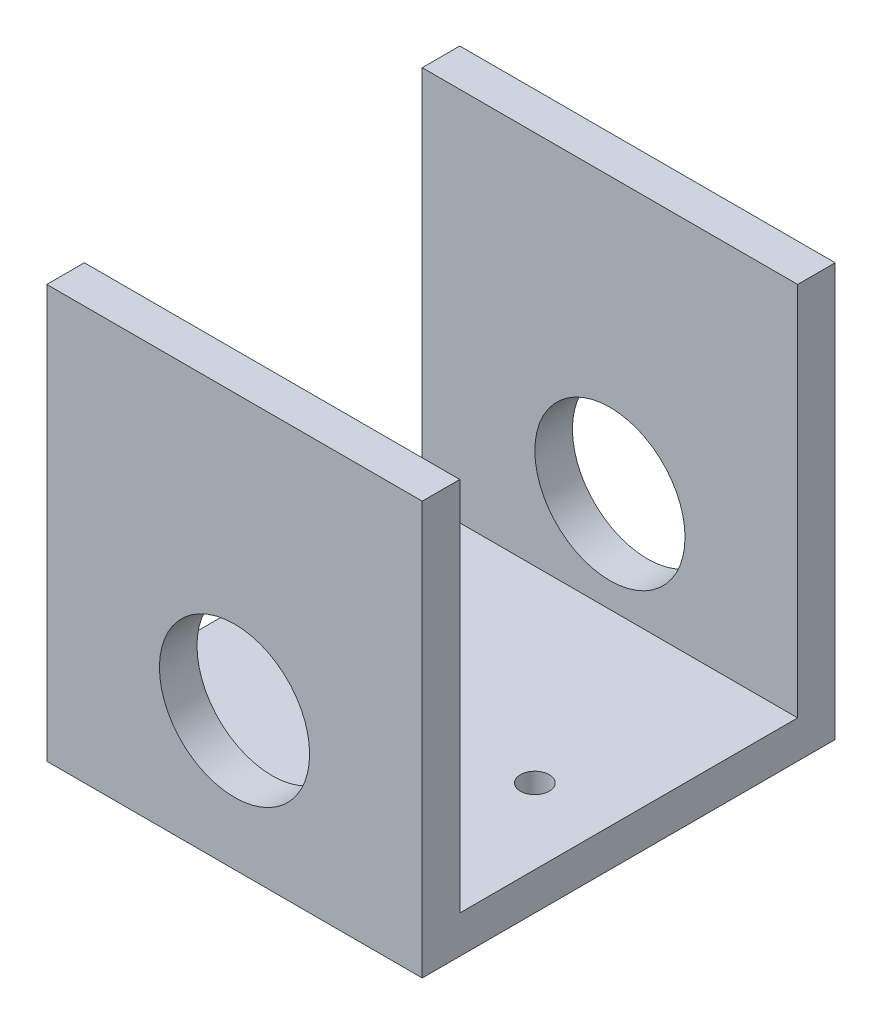
ISO-10303-21;
HEADER;
FILE_DESCRIPTION(('STEP AP214'),'2;1');
FILE_NAME('part.step','',(''),(''),'','','');
FILE_SCHEMA(('AUTOMOTIVE_DESIGN { 1 0 10303 214 1 1 1 1 }'));
ENDSEC;
DATA;
#1=APPLICATION_CONTEXT('core data for automotive mechanical design processes');
#2=APPLICATION_PROTOCOL_DEFINITION('international standard','automotive_design',2000,#1);
#3=PRODUCT_CONTEXT('',#1,'mechanical');
#4=PRODUCT('Part','Part','',(#3));
#5=PRODUCT_RELATED_PRODUCT_CATEGORY('part','',(#4));
#6=PRODUCT_DEFINITION_FORMATION('','',#4);
#7=PRODUCT_DEFINITION_CONTEXT('part definition',#1,'design');
#8=PRODUCT_DEFINITION('design','',#6,#7);
#9=PRODUCT_DEFINITION_SHAPE('','',#8);
#10=(LENGTH_UNIT() NAMED_UNIT(*) SI_UNIT(.MILLI.,.METRE.));
#11=(NAMED_UNIT(*) PLANE_ANGLE_UNIT() SI_UNIT($,.RADIAN.));
#12=(NAMED_UNIT(*) SI_UNIT($,.STERADIAN.) SOLID_ANGLE_UNIT());
#13=UNCERTAINTY_MEASURE_WITH_UNIT(LENGTH_MEASURE(1.E-05),#10,'distance_accuracy_value','');
#14=(GEOMETRIC_REPRESENTATION_CONTEXT(3) GLOBAL_UNCERTAINTY_ASSIGNED_CONTEXT((#13)) GLOBAL_UNIT_ASSIGNED_CONTEXT((#10,
#11,#12)) REPRESENTATION_CONTEXT('',''));
#15=CARTESIAN_POINT('',(0.,0.,0.));
#16=DIRECTION('',(0.,0.,1.));
#17=DIRECTION('',(1.,0.,0.));
#18=AXIS2_PLACEMENT_3D('',#15,#16,#17);
#19=CARTESIAN_POINT('',(0.,3.,0.));
#20=DIRECTION('',(0.,-1.,0.));
#21=DIRECTION('',(0.,0.,-1.));
#22=AXIS2_PLACEMENT_3D('',#19,#20,#21);
#23=PLANE('',#22);
#24=CARTESIAN_POINT('',(23.999988,3.,-12.));
#25=DIRECTION('',(0.,1.,0.));
#26=DIRECTION('',(0.,0.,1.));
#27=AXIS2_PLACEMENT_3D('',#24,#25,#26);
#28=CIRCLE('',#27,1.15);
#29=CARTESIAN_POINT('',(23.999988,3.,-10.85));
#30=VERTEX_POINT('',#29);
#31=EDGE_CURVE('E179',#30,#30,#28,.T.);
#32=ORIENTED_EDGE('',*,*,#31,.F.);
#33=EDGE_LOOP('',(#32));
#34=FACE_BOUND('',#33,.T.);
#35=CARTESIAN_POINT('',(5.999988,3.,-12.));
#36=DIRECTION('',(0.,1.,0.));
#37=DIRECTION('',(0.,0.,1.));
#38=AXIS2_PLACEMENT_3D('',#35,#36,#37);
#39=CIRCLE('',#38,1.15);
#40=CARTESIAN_POINT('',(5.999988,3.,-10.85));
#41=VERTEX_POINT('',#40);
#42=EDGE_CURVE('E187',#41,#41,#39,.T.);
#43=ORIENTED_EDGE('',*,*,#42,.F.);
#44=EDGE_LOOP('',(#43));
#45=FACE_BOUND('',#44,.T.);
#46=DIRECTION('',(1.,0.,0.));
#47=VECTOR('',#46,1.);
#48=CARTESIAN_POINT('',(30.,3.,-27.));
#49=LINE('',#48,#47);
#50=CARTESIAN_POINT('',(0.,3.,-27.));
#51=VERTEX_POINT('',#50);
#52=CARTESIAN_POINT('',(30.,3.,-27.));
#53=VERTEX_POINT('',#52);
#54=EDGE_CURVE('E59',#51,#53,#49,.T.);
#55=ORIENTED_EDGE('',*,*,#54,.F.);
#56=DIRECTION('',(0.,0.,1.));
#57=VECTOR('',#56,1.);
#58=CARTESIAN_POINT('',(0.,3.,0.));
#59=LINE('',#58,#57);
#60=CARTESIAN_POINT('',(0.,3.,0.));
#61=VERTEX_POINT('',#60);
#62=EDGE_CURVE('E195',#51,#61,#59,.T.);
#63=ORIENTED_EDGE('',*,*,#62,.T.);
#64=DIRECTION('',(1.,0.,0.));
#65=VECTOR('',#64,1.);
#66=CARTESIAN_POINT('',(0.,3.,0.));
#67=LINE('',#66,#65);
#68=CARTESIAN_POINT('',(30.,3.,0.));
#69=VERTEX_POINT('',#68);
#70=EDGE_CURVE('E198',#61,#69,#67,.T.);
#71=ORIENTED_EDGE('',*,*,#70,.T.);
#72=DIRECTION('',(0.,0.,-1.));
#73=VECTOR('',#72,1.);
#74=CARTESIAN_POINT('',(30.,3.,0.));
#75=LINE('',#74,#73);
#76=EDGE_CURVE('E202',#69,#53,#75,.T.);
#77=ORIENTED_EDGE('',*,*,#76,.T.);
#78=EDGE_LOOP('',(#55,#63,#71,#77));
#79=FACE_BOUND('',#78,.T.);
#80=ADVANCED_FACE('F43',(#34,#45,#79),#23,.F.);
#81=CARTESIAN_POINT('',(0.,0.,0.));
#82=DIRECTION('',(0.,-1.,0.));
#83=DIRECTION('',(0.,0.,-1.));
#84=AXIS2_PLACEMENT_3D('',#81,#82,#83);
#85=PLANE('',#84);
#86=CARTESIAN_POINT('',(5.999988,0.,-12.));
#87=DIRECTION('',(0.,1.,0.));
#88=DIRECTION('',(0.,0.,1.));
#89=AXIS2_PLACEMENT_3D('',#86,#87,#88);
#90=CIRCLE('',#89,1.15);
#91=CARTESIAN_POINT('',(5.999988,0.,-10.85));
#92=VERTEX_POINT('',#91);
#93=EDGE_CURVE('E183',#92,#92,#90,.T.);
#94=ORIENTED_EDGE('',*,*,#93,.T.);
#95=EDGE_LOOP('',(#94));
#96=FACE_BOUND('',#95,.T.);
#97=DIRECTION('',(0.,0.,1.));
#98=VECTOR('',#97,1.);
#99=CARTESIAN_POINT('',(0.,0.,0.));
#100=LINE('',#99,#98);
#101=CARTESIAN_POINT('',(0.,0.,-30.));
#102=VERTEX_POINT('',#101);
#103=CARTESIAN_POINT('',(0.,0.,3.));
#104=VERTEX_POINT('',#103);
#105=EDGE_CURVE('E191',#102,#104,#100,.T.);
#106=ORIENTED_EDGE('',*,*,#105,.F.);
#107=DIRECTION('',(-1.,0.,0.));
#108=VECTOR('',#107,1.);
#109=CARTESIAN_POINT('',(0.,0.,-30.));
#110=LINE('',#109,#108);
#111=CARTESIAN_POINT('',(30.,0.,-30.));
#112=VERTEX_POINT('',#111);
#113=EDGE_CURVE('E199',#112,#102,#110,.T.);
#114=ORIENTED_EDGE('',*,*,#113,.F.);
#115=DIRECTION('',(0.,0.,-1.));
#116=VECTOR('',#115,1.);
#117=CARTESIAN_POINT('',(30.,0.,0.));
#118=LINE('',#117,#116);
#119=CARTESIAN_POINT('',(30.,0.,3.));
#120=VERTEX_POINT('',#119);
#121=EDGE_CURVE('E82',#120,#112,#118,.T.);
#122=ORIENTED_EDGE('',*,*,#121,.F.);
#123=DIRECTION('',(1.,0.,0.));
#124=VECTOR('',#123,1.);
#125=CARTESIAN_POINT('',(30.,0.,3.));
#126=LINE('',#125,#124);
#127=EDGE_CURVE('E136',#104,#120,#126,.T.);
#128=ORIENTED_EDGE('',*,*,#127,.F.);
#129=EDGE_LOOP('',(#106,#114,#122,#128));
#130=FACE_BOUND('',#129,.T.);
#131=CARTESIAN_POINT('',(23.999988,0.,-12.));
#132=DIRECTION('',(0.,1.,0.));
#133=DIRECTION('',(0.,0.,1.));
#134=AXIS2_PLACEMENT_3D('',#131,#132,#133);
#135=CIRCLE('',#134,1.15);
#136=CARTESIAN_POINT('',(23.999988,0.,-10.85));
#137=VERTEX_POINT('',#136);
#138=EDGE_CURVE('E178',#137,#137,#135,.T.);
#139=ORIENTED_EDGE('',*,*,#138,.T.);
#140=EDGE_LOOP('',(#139));
#141=FACE_BOUND('',#140,.T.);
#142=ADVANCED_FACE('F220',(#96,#130,#141),#85,.T.);
#143=CARTESIAN_POINT('',(0.,3.,0.));
#144=DIRECTION('',(1.,0.,0.));
#145=DIRECTION('',(0.,0.,-1.));
#146=AXIS2_PLACEMENT_3D('',#143,#144,#145);
#147=PLANE('',#146);
#148=ORIENTED_EDGE('',*,*,#105,.T.);
#149=DIRECTION('',(0.,-1.,0.));
#150=VECTOR('',#149,1.);
#151=CARTESIAN_POINT('',(0.,0.,3.));
#152=LINE('',#151,#150);
#153=CARTESIAN_POINT('',(0.,33.,3.));
#154=VERTEX_POINT('',#153);
#155=EDGE_CURVE('E129',#154,#104,#152,.T.);
#156=ORIENTED_EDGE('',*,*,#155,.F.);
#157=DIRECTION('',(0.,0.,-1.));
#158=VECTOR('',#157,1.);
#159=CARTESIAN_POINT('',(0.,33.,3.));
#160=LINE('',#159,#158);
#161=CARTESIAN_POINT('',(0.,33.,0.));
#162=VERTEX_POINT('',#161);
#163=EDGE_CURVE('E124',#154,#162,#160,.T.);
#164=ORIENTED_EDGE('',*,*,#163,.T.);
#165=DIRECTION('',(0.,-1.,0.));
#166=VECTOR('',#165,1.);
#167=CARTESIAN_POINT('',(0.,0.,0.));
#168=LINE('',#167,#166);
#169=EDGE_CURVE('E138',#162,#61,#168,.T.);
#170=ORIENTED_EDGE('',*,*,#169,.T.);
#171=ORIENTED_EDGE('',*,*,#62,.F.);
#172=DIRECTION('',(0.,-1.,0.));
#173=VECTOR('',#172,1.);
#174=CARTESIAN_POINT('',(0.,33.,-27.));
#175=LINE('',#174,#173);
#176=CARTESIAN_POINT('',(0.,33.,-27.));
#177=VERTEX_POINT('',#176);
#178=EDGE_CURVE('E174',#177,#51,#175,.T.);
#179=ORIENTED_EDGE('',*,*,#178,.F.);
#180=DIRECTION('',(0.,0.,1.));
#181=VECTOR('',#180,1.);
#182=CARTESIAN_POINT('',(0.,33.,-30.));
#183=LINE('',#182,#181);
#184=CARTESIAN_POINT('',(0.,33.,-30.));
#185=VERTEX_POINT('',#184);
#186=EDGE_CURVE('E163',#185,#177,#183,.T.);
#187=ORIENTED_EDGE('',*,*,#186,.F.);
#188=DIRECTION('',(0.,-1.,0.));
#189=VECTOR('',#188,1.);
#190=CARTESIAN_POINT('',(0.,3.,-30.));
#191=LINE('',#190,#189);
#192=EDGE_CURVE('E52',#185,#102,#191,.T.);
#193=ORIENTED_EDGE('',*,*,#192,.T.);
#194=EDGE_LOOP('',(#148,#156,#164,#170,#171,#179,#187,#193));
#195=FACE_BOUND('',#194,.T.);
#196=ADVANCED_FACE('F45',(#195),#147,.F.);
#197=CARTESIAN_POINT('',(30.,3.,0.));
#198=DIRECTION('',(-1.,0.,0.));
#199=DIRECTION('',(0.,0.,1.));
#200=AXIS2_PLACEMENT_3D('',#197,#198,#199);
#201=PLANE('',#200);
#202=ORIENTED_EDGE('',*,*,#121,.T.);
#203=DIRECTION('',(0.,-1.,0.));
#204=VECTOR('',#203,1.);
#205=CARTESIAN_POINT('',(30.,3.,-30.));
#206=LINE('',#205,#204);
#207=CARTESIAN_POINT('',(30.,33.,-30.));
#208=VERTEX_POINT('',#207);
#209=EDGE_CURVE('E11',#208,#112,#206,.T.);
#210=ORIENTED_EDGE('',*,*,#209,.F.);
#211=DIRECTION('',(0.,0.,-1.));
#212=VECTOR('',#211,1.);
#213=CARTESIAN_POINT('',(30.,33.,-30.));
#214=LINE('',#213,#212);
#215=CARTESIAN_POINT('',(30.,33.,-27.));
#216=VERTEX_POINT('',#215);
#217=EDGE_CURVE('E156',#216,#208,#214,.T.);
#218=ORIENTED_EDGE('',*,*,#217,.F.);
#219=DIRECTION('',(0.,-1.,0.));
#220=VECTOR('',#219,1.);
#221=CARTESIAN_POINT('',(30.,33.,-27.));
#222=LINE('',#221,#220);
#223=EDGE_CURVE('E168',#216,#53,#222,.T.);
#224=ORIENTED_EDGE('',*,*,#223,.T.);
#225=ORIENTED_EDGE('',*,*,#76,.F.);
#226=DIRECTION('',(0.,1.,0.));
#227=VECTOR('',#226,1.);
#228=CARTESIAN_POINT('',(30.,0.,0.));
#229=LINE('',#228,#227);
#230=CARTESIAN_POINT('',(30.,33.,0.));
#231=VERTEX_POINT('',#230);
#232=EDGE_CURVE('E68',#69,#231,#229,.T.);
#233=ORIENTED_EDGE('',*,*,#232,.T.);
#234=DIRECTION('',(0.,0.,-1.));
#235=VECTOR('',#234,1.);
#236=CARTESIAN_POINT('',(30.,33.,3.));
#237=LINE('',#236,#235);
#238=CARTESIAN_POINT('',(30.,33.,3.));
#239=VERTEX_POINT('',#238);
#240=EDGE_CURVE('E122',#239,#231,#237,.T.);
#241=ORIENTED_EDGE('',*,*,#240,.F.);
#242=DIRECTION('',(0.,1.,0.));
#243=VECTOR('',#242,1.);
#244=CARTESIAN_POINT('',(30.,0.,3.));
#245=LINE('',#244,#243);
#246=EDGE_CURVE('E130',#120,#239,#245,.T.);
#247=ORIENTED_EDGE('',*,*,#246,.F.);
#248=EDGE_LOOP('',(#202,#210,#218,#224,#225,#233,#241,#247));
#249=FACE_BOUND('',#248,.T.);
#250=ADVANCED_FACE('F140',(#249),#201,.F.);
#251=CARTESIAN_POINT('',(0.,3.,-30.));
#252=DIRECTION('',(0.,0.,1.));
#253=DIRECTION('',(1.,0.,0.));
#254=AXIS2_PLACEMENT_3D('',#251,#252,#253);
#255=PLANE('',#254);
#256=CARTESIAN_POINT('',(15.,11.,-30.));
#257=DIRECTION('',(0.,0.,-1.));
#258=DIRECTION('',(-1.,0.,0.));
#259=AXIS2_PLACEMENT_3D('',#256,#257,#258);
#260=CIRCLE('',#259,6.);
#261=CARTESIAN_POINT('',(9.,11.,-30.));
#262=VERTEX_POINT('',#261);
#263=EDGE_CURVE('E143',#262,#262,#260,.T.);
#264=ORIENTED_EDGE('',*,*,#263,.F.);
#265=EDGE_LOOP('',(#264));
#266=FACE_BOUND('',#265,.T.);
#267=ORIENTED_EDGE('',*,*,#113,.T.);
#268=ORIENTED_EDGE('',*,*,#192,.F.);
#269=DIRECTION('',(-1.,0.,0.));
#270=VECTOR('',#269,1.);
#271=CARTESIAN_POINT('',(30.,33.,-30.));
#272=LINE('',#271,#270);
#273=EDGE_CURVE('E159',#208,#185,#272,.T.);
#274=ORIENTED_EDGE('',*,*,#273,.F.);
#275=ORIENTED_EDGE('',*,*,#209,.T.);
#276=EDGE_LOOP('',(#267,#268,#274,#275));
#277=FACE_BOUND('',#276,.T.);
#278=ADVANCED_FACE('F265',(#266,#277),#255,.F.);
#279=CARTESIAN_POINT('',(5.999988,3.,-12.));
#280=DIRECTION('',(0.,-1.,0.));
#281=DIRECTION('',(0.,0.,-1.));
#282=AXIS2_PLACEMENT_3D('',#279,#280,#281);
#283=CYLINDRICAL_SURFACE('',#282,1.15);
#284=ORIENTED_EDGE('',*,*,#42,.T.);
#285=EDGE_LOOP('',(#284));
#286=FACE_BOUND('',#285,.T.);
#287=ORIENTED_EDGE('',*,*,#93,.F.);
#288=EDGE_LOOP('',(#287));
#289=FACE_BOUND('',#288,.T.);
#290=ADVANCED_FACE('F249',(#286,#289),#283,.F.);
#291=CARTESIAN_POINT('',(23.999988,3.,-12.));
#292=DIRECTION('',(0.,-1.,0.));
#293=DIRECTION('',(0.,0.,-1.));
#294=AXIS2_PLACEMENT_3D('',#291,#292,#293);
#295=CYLINDRICAL_SURFACE('',#294,1.15);
#296=ORIENTED_EDGE('',*,*,#31,.T.);
#297=EDGE_LOOP('',(#296));
#298=FACE_BOUND('',#297,.T.);
#299=ORIENTED_EDGE('',*,*,#138,.F.);
#300=EDGE_LOOP('',(#299));
#301=FACE_BOUND('',#300,.T.);
#302=ADVANCED_FACE('F240',(#298,#301),#295,.F.);
#303=CARTESIAN_POINT('',(30.,33.,-27.));
#304=DIRECTION('',(0.,0.,-1.));
#305=DIRECTION('',(-1.,0.,0.));
#306=AXIS2_PLACEMENT_3D('',#303,#304,#305);
#307=PLANE('',#306);
#308=CARTESIAN_POINT('',(15.,11.,-27.));
#309=DIRECTION('',(0.,0.,-1.));
#310=DIRECTION('',(-1.,0.,0.));
#311=AXIS2_PLACEMENT_3D('',#308,#309,#310);
#312=CIRCLE('',#311,6.);
#313=CARTESIAN_POINT('',(9.,11.,-27.));
#314=VERTEX_POINT('',#313);
#315=EDGE_CURVE('E148',#314,#314,#312,.F.);
#316=ORIENTED_EDGE('',*,*,#315,.F.);
#317=EDGE_LOOP('',(#316));
#318=FACE_BOUND('',#317,.T.);
#319=ORIENTED_EDGE('',*,*,#54,.T.);
#320=ORIENTED_EDGE('',*,*,#223,.F.);
#321=DIRECTION('',(1.,0.,0.));
#322=VECTOR('',#321,1.);
#323=CARTESIAN_POINT('',(30.,33.,-27.));
#324=LINE('',#323,#322);
#325=EDGE_CURVE('E89',#177,#216,#324,.T.);
#326=ORIENTED_EDGE('',*,*,#325,.F.);
#327=ORIENTED_EDGE('',*,*,#178,.T.);
#328=EDGE_LOOP('',(#319,#320,#326,#327));
#329=FACE_BOUND('',#328,.T.);
#330=ADVANCED_FACE('F237',(#318,#329),#307,.F.);
#331=CARTESIAN_POINT('',(0.,33.,0.));
#332=DIRECTION('',(0.,-1.,0.));
#333=DIRECTION('',(0.,0.,-1.));
#334=AXIS2_PLACEMENT_3D('',#331,#332,#333);
#335=PLANE('',#334);
#336=ORIENTED_EDGE('',*,*,#217,.T.);
#337=ORIENTED_EDGE('',*,*,#273,.T.);
#338=ORIENTED_EDGE('',*,*,#186,.T.);
#339=ORIENTED_EDGE('',*,*,#325,.T.);
#340=EDGE_LOOP('',(#336,#337,#338,#339));
#341=FACE_BOUND('',#340,.T.);
#342=ADVANCED_FACE('F239',(#341),#335,.F.);
#343=CARTESIAN_POINT('',(15.,11.,0.001000000000001));
#344=DIRECTION('',(0.,0.,-1.));
#345=DIRECTION('',(-1.,0.,0.));
#346=AXIS2_PLACEMENT_3D('',#343,#344,#345);
#347=CYLINDRICAL_SURFACE('',#346,6.);
#348=ORIENTED_EDGE('',*,*,#263,.T.);
#349=EDGE_LOOP('',(#348));
#350=FACE_BOUND('',#349,.T.);
#351=ORIENTED_EDGE('',*,*,#315,.T.);
#352=EDGE_LOOP('',(#351));
#353=FACE_BOUND('',#352,.T.);
#354=ADVANCED_FACE('F247',(#350,#353),#347,.F.);
#355=CARTESIAN_POINT('',(0.,0.,3.));
#356=DIRECTION('',(0.,0.,1.));
#357=DIRECTION('',(1.,0.,0.));
#358=AXIS2_PLACEMENT_3D('',#355,#356,#357);
#359=PLANE('',#358);
#360=ORIENTED_EDGE('',*,*,#246,.T.);
#361=DIRECTION('',(-1.,0.,0.));
#362=VECTOR('',#361,1.);
#363=CARTESIAN_POINT('',(30.,33.,3.));
#364=LINE('',#363,#362);
#365=EDGE_CURVE('E118',#239,#154,#364,.T.);
#366=ORIENTED_EDGE('',*,*,#365,.T.);
#367=ORIENTED_EDGE('',*,*,#155,.T.);
#368=ORIENTED_EDGE('',*,*,#127,.T.);
#369=EDGE_LOOP('',(#360,#366,#367,#368));
#370=FACE_BOUND('',#369,.T.);
#371=CARTESIAN_POINT('',(15.,11.,3.));
#372=DIRECTION('',(0.,0.,1.));
#373=DIRECTION('',(1.,0.,0.));
#374=AXIS2_PLACEMENT_3D('',#371,#372,#373);
#375=CIRCLE('',#374,6.);
#376=CARTESIAN_POINT('',(21.,11.,3.));
#377=VERTEX_POINT('',#376);
#378=EDGE_CURVE('E230',#377,#377,#375,.T.);
#379=ORIENTED_EDGE('',*,*,#378,.F.);
#380=EDGE_LOOP('',(#379));
#381=FACE_BOUND('',#380,.T.);
#382=ADVANCED_FACE('F133',(#370,#381),#359,.T.);
#383=CARTESIAN_POINT('',(0.,0.,0.));
#384=DIRECTION('',(0.,0.,1.));
#385=DIRECTION('',(1.,0.,0.));
#386=AXIS2_PLACEMENT_3D('',#383,#384,#385);
#387=PLANE('',#386);
#388=ORIENTED_EDGE('',*,*,#70,.F.);
#389=ORIENTED_EDGE('',*,*,#169,.F.);
#390=DIRECTION('',(-1.,0.,0.));
#391=VECTOR('',#390,1.);
#392=CARTESIAN_POINT('',(30.,33.,0.));
#393=LINE('',#392,#391);
#394=EDGE_CURVE('E229',#231,#162,#393,.T.);
#395=ORIENTED_EDGE('',*,*,#394,.F.);
#396=ORIENTED_EDGE('',*,*,#232,.F.);
#397=EDGE_LOOP('',(#388,#389,#395,#396));
#398=FACE_BOUND('',#397,.T.);
#399=CARTESIAN_POINT('',(15.,11.,0.));
#400=DIRECTION('',(0.,0.,1.));
#401=DIRECTION('',(1.,0.,0.));
#402=AXIS2_PLACEMENT_3D('',#399,#400,#401);
#403=CIRCLE('',#402,6.);
#404=CARTESIAN_POINT('',(21.,11.,0.));
#405=VERTEX_POINT('',#404);
#406=EDGE_CURVE('E413',#405,#405,#403,.T.);
#407=ORIENTED_EDGE('',*,*,#406,.T.);
#408=EDGE_LOOP('',(#407));
#409=FACE_BOUND('',#408,.T.);
#410=ADVANCED_FACE('F372',(#398,#409),#387,.F.);
#411=CARTESIAN_POINT('',(30.,33.,3.));
#412=DIRECTION('',(0.,-1.,0.));
#413=DIRECTION('',(1.,0.,0.));
#414=AXIS2_PLACEMENT_3D('',#411,#412,#413);
#415=PLANE('',#414);
#416=ORIENTED_EDGE('',*,*,#394,.T.);
#417=ORIENTED_EDGE('',*,*,#163,.F.);
#418=ORIENTED_EDGE('',*,*,#365,.F.);
#419=ORIENTED_EDGE('',*,*,#240,.T.);
#420=EDGE_LOOP('',(#416,#417,#418,#419));
#421=FACE_BOUND('',#420,.T.);
#422=ADVANCED_FACE('F120',(#421),#415,.F.);
#423=CARTESIAN_POINT('',(15.,11.,3.));
#424=DIRECTION('',(0.,0.,-1.));
#425=DIRECTION('',(-1.,0.,0.));
#426=AXIS2_PLACEMENT_3D('',#423,#424,#425);
#427=CYLINDRICAL_SURFACE('',#426,6.);
#428=ORIENTED_EDGE('',*,*,#378,.T.);
#429=EDGE_LOOP('',(#428));
#430=FACE_BOUND('',#429,.T.);
#431=ORIENTED_EDGE('',*,*,#406,.F.);
#432=EDGE_LOOP('',(#431));
#433=FACE_BOUND('',#432,.T.);
#434=ADVANCED_FACE('F391',(#430,#433),#427,.F.);
#435=CLOSED_SHELL('',(#80,#142,#196,#250,#278,#290,#302,#330,#342,#354,#382,#410,#422,#434));
#436=MANIFOLD_SOLID_BREP('B2',#435);
#437=ADVANCED_BREP_SHAPE_REPRESENTATION('',(#18,#436),#14);
#438=SHAPE_DEFINITION_REPRESENTATION(#9,#437);
ENDSEC;
END-ISO-10303-21;
